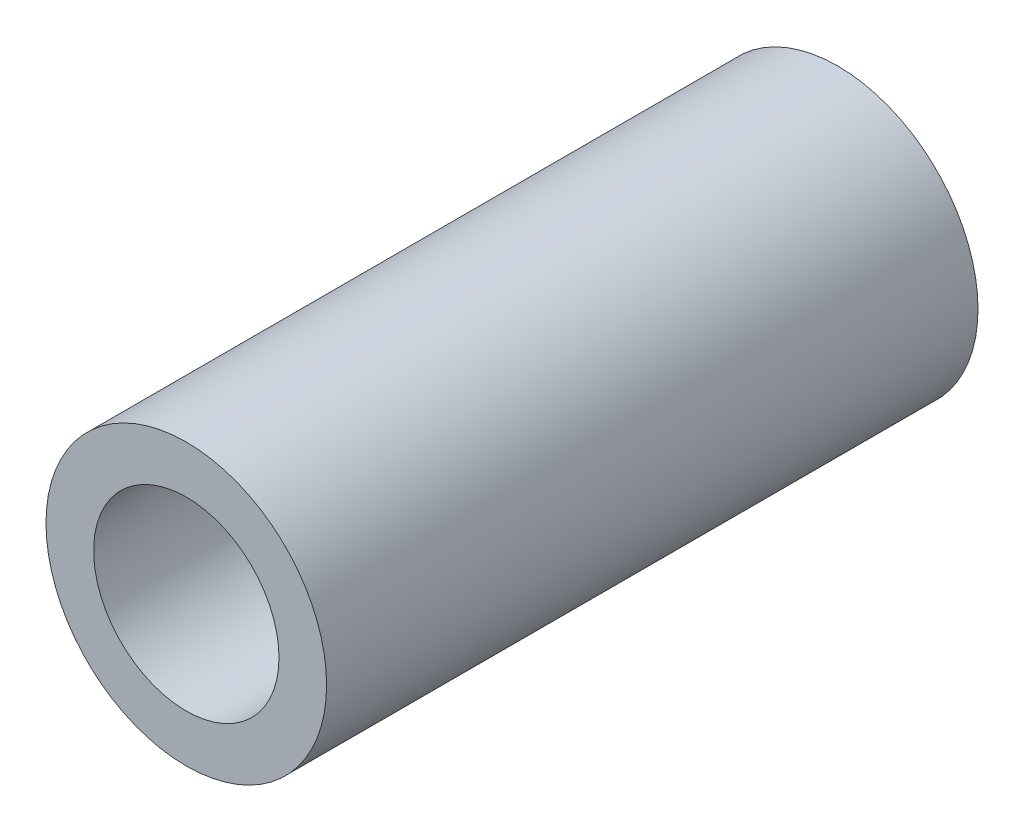
ISO-10303-21;
HEADER;
FILE_DESCRIPTION(('STEP AP214'),'2;1');
FILE_NAME('part.step','',(''),(''),'','','');
FILE_SCHEMA(('AUTOMOTIVE_DESIGN { 1 0 10303 214 1 1 1 1 }'));
ENDSEC;
DATA;
#1=APPLICATION_CONTEXT('core data for automotive mechanical design processes');
#2=APPLICATION_PROTOCOL_DEFINITION('international standard','automotive_design',2000,#1);
#3=PRODUCT_CONTEXT('',#1,'mechanical');
#4=PRODUCT('Part','Part','',(#3));
#5=PRODUCT_RELATED_PRODUCT_CATEGORY('part','',(#4));
#6=PRODUCT_DEFINITION_FORMATION('','',#4);
#7=PRODUCT_DEFINITION_CONTEXT('part definition',#1,'design');
#8=PRODUCT_DEFINITION('design','',#6,#7);
#9=PRODUCT_DEFINITION_SHAPE('','',#8);
#10=(LENGTH_UNIT() NAMED_UNIT(*) SI_UNIT(.MILLI.,.METRE.));
#11=(NAMED_UNIT(*) PLANE_ANGLE_UNIT() SI_UNIT($,.RADIAN.));
#12=(NAMED_UNIT(*) SI_UNIT($,.STERADIAN.) SOLID_ANGLE_UNIT());
#13=UNCERTAINTY_MEASURE_WITH_UNIT(LENGTH_MEASURE(1.E-05),#10,'distance_accuracy_value','');
#14=(GEOMETRIC_REPRESENTATION_CONTEXT(3) GLOBAL_UNCERTAINTY_ASSIGNED_CONTEXT((#13)) GLOBAL_UNIT_ASSIGNED_CONTEXT((#10,
#11,#12)) REPRESENTATION_CONTEXT('',''));
#15=CARTESIAN_POINT('',(0.,0.,0.));
#16=DIRECTION('',(0.,0.,1.));
#17=DIRECTION('',(1.,0.,0.));
#18=AXIS2_PLACEMENT_3D('',#15,#16,#17);
#19=CARTESIAN_POINT('',(-23.7642770352369,16.8047387606318,65.));
#20=DIRECTION('',(0.,0.,-1.));
#21=DIRECTION('',(-1.,0.,0.));
#22=AXIS2_PLACEMENT_3D('',#19,#20,#21);
#23=CYLINDRICAL_SURFACE('',#22,14.);
#24=CARTESIAN_POINT('',(-23.7642770352369,16.8047387606318,65.));
#25=DIRECTION('',(0.,0.,1.));
#26=DIRECTION('',(1.,0.,0.));
#27=AXIS2_PLACEMENT_3D('',#24,#25,#26);
#28=CIRCLE('',#27,14.);
#29=CARTESIAN_POINT('',(-9.76427703523693,16.8047387606318,65.));
#30=VERTEX_POINT('',#29);
#31=EDGE_CURVE('E10',#30,#30,#28,.T.);
#32=ORIENTED_EDGE('',*,*,#31,.F.);
#33=EDGE_LOOP('',(#32));
#34=FACE_BOUND('',#33,.T.);
#35=CARTESIAN_POINT('',(-23.7642770352369,16.8047387606318,0.));
#36=DIRECTION('',(0.,0.,1.));
#37=DIRECTION('',(1.,0.,0.));
#38=AXIS2_PLACEMENT_3D('',#35,#36,#37);
#39=CIRCLE('',#38,14.);
#40=CARTESIAN_POINT('',(-9.76427703523693,16.8047387606318,0.));
#41=VERTEX_POINT('',#40);
#42=EDGE_CURVE('E41',#41,#41,#39,.T.);
#43=ORIENTED_EDGE('',*,*,#42,.T.);
#44=EDGE_LOOP('',(#43));
#45=FACE_BOUND('',#44,.T.);
#46=ADVANCED_FACE('F38',(#34,#45),#23,.T.);
#47=CARTESIAN_POINT('',(-23.7642770352369,16.8047387606318,65.));
#48=DIRECTION('',(0.,0.,1.));
#49=DIRECTION('',(1.,0.,0.));
#50=AXIS2_PLACEMENT_3D('',#47,#48,#49);
#51=PLANE('',#50);
#52=CARTESIAN_POINT('',(-23.7642770352369,16.8047387606318,65.));
#53=DIRECTION('',(0.,0.,1.));
#54=DIRECTION('',(1.,0.,0.));
#55=AXIS2_PLACEMENT_3D('',#52,#53,#54);
#56=CIRCLE('',#55,9.25);
#57=CARTESIAN_POINT('',(-14.5142770352369,16.8047387606318,65.));
#58=VERTEX_POINT('',#57);
#59=EDGE_CURVE('E48',#58,#58,#56,.T.);
#60=ORIENTED_EDGE('',*,*,#59,.F.);
#61=EDGE_LOOP('',(#60));
#62=FACE_BOUND('',#61,.T.);
#63=ORIENTED_EDGE('',*,*,#31,.T.);
#64=EDGE_LOOP('',(#63));
#65=FACE_BOUND('',#64,.T.);
#66=ADVANCED_FACE('F59',(#62,#65),#51,.T.);
#67=CARTESIAN_POINT('',(-23.7642770352369,16.8047387606318,0.));
#68=DIRECTION('',(0.,0.,1.));
#69=DIRECTION('',(1.,0.,0.));
#70=AXIS2_PLACEMENT_3D('',#67,#68,#69);
#71=PLANE('',#70);
#72=CARTESIAN_POINT('',(-23.7642770352369,16.8047387606318,0.));
#73=DIRECTION('',(0.,0.,1.));
#74=DIRECTION('',(1.,0.,0.));
#75=AXIS2_PLACEMENT_3D('',#72,#73,#74);
#76=CIRCLE('',#75,9.25);
#77=CARTESIAN_POINT('',(-14.5142770352369,16.8047387606318,0.));
#78=VERTEX_POINT('',#77);
#79=EDGE_CURVE('E50',#78,#78,#76,.T.);
#80=ORIENTED_EDGE('',*,*,#79,.T.);
#81=EDGE_LOOP('',(#80));
#82=FACE_BOUND('',#81,.T.);
#83=ORIENTED_EDGE('',*,*,#42,.F.);
#84=EDGE_LOOP('',(#83));
#85=FACE_BOUND('',#84,.T.);
#86=ADVANCED_FACE('F61',(#82,#85),#71,.F.);
#87=CARTESIAN_POINT('',(-23.7642770352369,16.8047387606318,65.));
#88=DIRECTION('',(0.,0.,-1.));
#89=DIRECTION('',(-1.,0.,0.));
#90=AXIS2_PLACEMENT_3D('',#87,#88,#89);
#91=CYLINDRICAL_SURFACE('',#90,9.25);
#92=ORIENTED_EDGE('',*,*,#59,.T.);
#93=EDGE_LOOP('',(#92));
#94=FACE_BOUND('',#93,.T.);
#95=ORIENTED_EDGE('',*,*,#79,.F.);
#96=EDGE_LOOP('',(#95));
#97=FACE_BOUND('',#96,.T.);
#98=ADVANCED_FACE('F56',(#94,#97),#91,.F.);
#99=CLOSED_SHELL('',(#46,#66,#86,#98));
#100=MANIFOLD_SOLID_BREP('B2',#99);
#101=ADVANCED_BREP_SHAPE_REPRESENTATION('',(#18,#100),#14);
#102=SHAPE_DEFINITION_REPRESENTATION(#9,#101);
ENDSEC;
END-ISO-10303-21;
